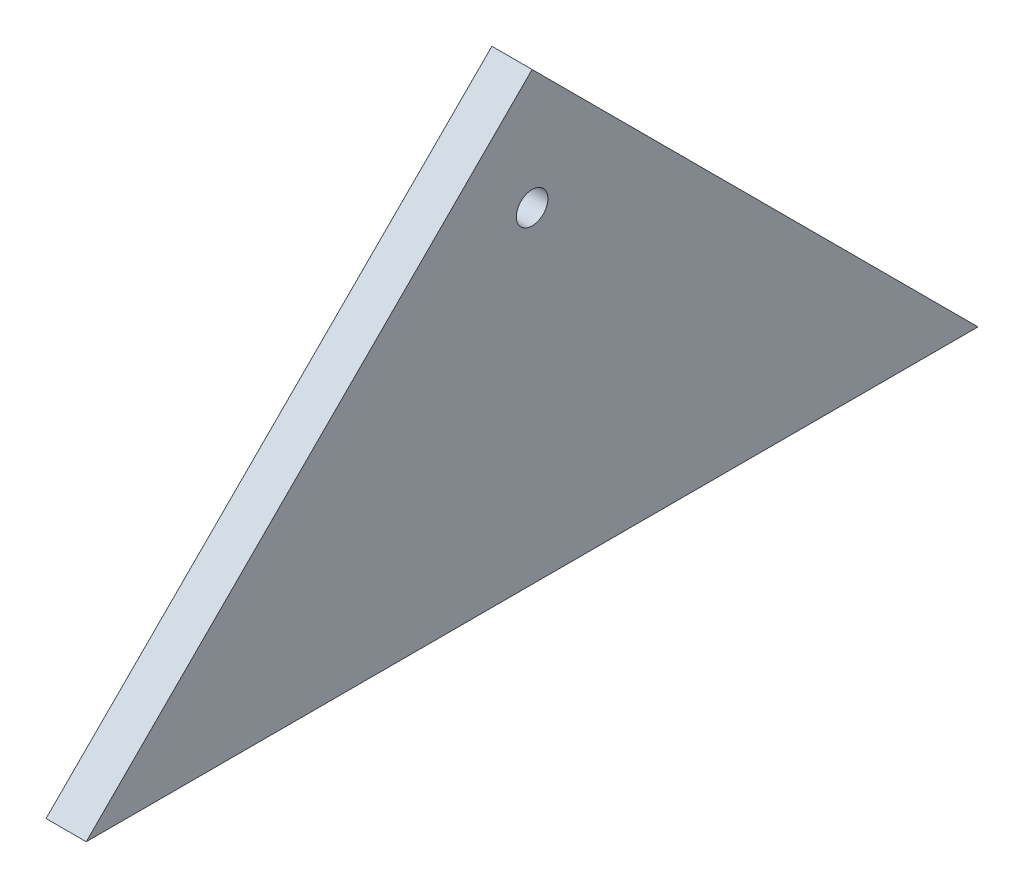
ISO-10303-21;
HEADER;
FILE_DESCRIPTION(('STEP AP214'),'2;1');
FILE_NAME('part.step','',(''),(''),'','','');
FILE_SCHEMA(('AUTOMOTIVE_DESIGN { 1 0 10303 214 1 1 1 1 }'));
ENDSEC;
DATA;
#1=APPLICATION_CONTEXT('core data for automotive mechanical design processes');
#2=APPLICATION_PROTOCOL_DEFINITION('international standard','automotive_design',2000,#1);
#3=PRODUCT_CONTEXT('',#1,'mechanical');
#4=PRODUCT('Part','Part','',(#3));
#5=PRODUCT_RELATED_PRODUCT_CATEGORY('part','',(#4));
#6=PRODUCT_DEFINITION_FORMATION('','',#4);
#7=PRODUCT_DEFINITION_CONTEXT('part definition',#1,'design');
#8=PRODUCT_DEFINITION('design','',#6,#7);
#9=PRODUCT_DEFINITION_SHAPE('','',#8);
#10=(LENGTH_UNIT() NAMED_UNIT(*) SI_UNIT(.MILLI.,.METRE.));
#11=(NAMED_UNIT(*) PLANE_ANGLE_UNIT() SI_UNIT($,.RADIAN.));
#12=(NAMED_UNIT(*) SI_UNIT($,.STERADIAN.) SOLID_ANGLE_UNIT());
#13=UNCERTAINTY_MEASURE_WITH_UNIT(LENGTH_MEASURE(1.E-05),#10,'distance_accuracy_value','');
#14=(GEOMETRIC_REPRESENTATION_CONTEXT(3) GLOBAL_UNCERTAINTY_ASSIGNED_CONTEXT((#13)) GLOBAL_UNIT_ASSIGNED_CONTEXT((#10,
#11,#12)) REPRESENTATION_CONTEXT('',''));
#15=CARTESIAN_POINT('',(0.,0.,0.));
#16=DIRECTION('',(0.,0.,1.));
#17=DIRECTION('',(1.,0.,0.));
#18=AXIS2_PLACEMENT_3D('',#15,#16,#17);
#19=CARTESIAN_POINT('',(12.1539,0.,0.));
#20=DIRECTION('',(1.,0.,0.));
#21=DIRECTION('',(0.,0.,-1.));
#22=AXIS2_PLACEMENT_3D('',#19,#20,#21);
#23=PLANE('',#22);
#24=DIRECTION('',(0.,0.707106781186548,0.707106781186548));
#25=VECTOR('',#24,1.);
#26=CARTESIAN_POINT('',(12.1539,-98.5342418160373,-134.703841816037));
#27=LINE('',#26,#25);
#28=CARTESIAN_POINT('',(12.1539,-98.5342418160373,-134.703841816037));
#29=VERTEX_POINT('',#28);
#30=CARTESIAN_POINT('',(12.1539,36.1696,0.));
#31=VERTEX_POINT('',#30);
#32=EDGE_CURVE('E73',#29,#31,#27,.T.);
#33=ORIENTED_EDGE('',*,*,#32,.T.);
#34=DIRECTION('',(0.,-0.707106781186548,0.707106781186548));
#35=VECTOR('',#34,1.);
#36=CARTESIAN_POINT('',(12.1539,36.1696,0.));
#37=LINE('',#36,#35);
#38=CARTESIAN_POINT('',(12.1539,-98.5342418160373,134.703841816037));
#39=VERTEX_POINT('',#38);
#40=EDGE_CURVE('E69',#31,#39,#37,.T.);
#41=ORIENTED_EDGE('',*,*,#40,.T.);
#42=DIRECTION('',(0.,0.,-1.));
#43=VECTOR('',#42,1.);
#44=CARTESIAN_POINT('',(12.1539,-98.5342418160373,134.703841816037));
#45=LINE('',#44,#43);
#46=EDGE_CURVE('E49',#39,#29,#45,.T.);
#47=ORIENTED_EDGE('',*,*,#46,.T.);
#48=EDGE_LOOP('',(#33,#41,#47));
#49=FACE_BOUND('',#48,.T.);
#50=CARTESIAN_POINT('',(12.1539,0.,0.));
#51=DIRECTION('',(1.,0.,0.));
#52=DIRECTION('',(0.,0.,-1.));
#53=AXIS2_PLACEMENT_3D('',#50,#51,#52);
#54=CIRCLE('',#53,4.7625);
#55=CARTESIAN_POINT('',(12.1539,0.,-4.7625));
#56=VERTEX_POINT('',#55);
#57=EDGE_CURVE('E83',#56,#56,#54,.T.);
#58=ORIENTED_EDGE('',*,*,#57,.F.);
#59=EDGE_LOOP('',(#58));
#60=FACE_BOUND('',#59,.T.);
#61=ADVANCED_FACE('F32',(#49,#60),#23,.T.);
#62=CARTESIAN_POINT('',(0.,0.,0.));
#63=DIRECTION('',(1.,0.,0.));
#64=DIRECTION('',(0.,0.,-1.));
#65=AXIS2_PLACEMENT_3D('',#62,#63,#64);
#66=PLANE('',#65);
#67=DIRECTION('',(0.,0.707106781186548,0.707106781186548));
#68=VECTOR('',#67,1.);
#69=CARTESIAN_POINT('',(0.,-98.5342418160373,-134.703841816037));
#70=LINE('',#69,#68);
#71=CARTESIAN_POINT('',(0.,-98.5342418160373,-134.703841816037));
#72=VERTEX_POINT('',#71);
#73=CARTESIAN_POINT('',(0.,36.1696,0.));
#74=VERTEX_POINT('',#73);
#75=EDGE_CURVE('E80',#72,#74,#70,.T.);
#76=ORIENTED_EDGE('',*,*,#75,.F.);
#77=DIRECTION('',(0.,0.,-1.));
#78=VECTOR('',#77,1.);
#79=CARTESIAN_POINT('',(0.,-98.5342418160373,134.703841816037));
#80=LINE('',#79,#78);
#81=CARTESIAN_POINT('',(0.,-98.5342418160373,134.703841816037));
#82=VERTEX_POINT('',#81);
#83=EDGE_CURVE('E66',#82,#72,#80,.T.);
#84=ORIENTED_EDGE('',*,*,#83,.F.);
#85=DIRECTION('',(0.,-0.707106781186548,0.707106781186548));
#86=VECTOR('',#85,1.);
#87=CARTESIAN_POINT('',(0.,36.1696,0.));
#88=LINE('',#87,#86);
#89=EDGE_CURVE('E61',#74,#82,#88,.T.);
#90=ORIENTED_EDGE('',*,*,#89,.F.);
#91=EDGE_LOOP('',(#76,#84,#90));
#92=FACE_BOUND('',#91,.T.);
#93=CARTESIAN_POINT('',(0.,0.,0.));
#94=DIRECTION('',(1.,0.,0.));
#95=DIRECTION('',(0.,0.,-1.));
#96=AXIS2_PLACEMENT_3D('',#93,#94,#95);
#97=CIRCLE('',#96,4.7625);
#98=CARTESIAN_POINT('',(0.,0.,-4.7625));
#99=VERTEX_POINT('',#98);
#100=EDGE_CURVE('E87',#99,#99,#97,.T.);
#101=ORIENTED_EDGE('',*,*,#100,.T.);
#102=EDGE_LOOP('',(#101));
#103=FACE_BOUND('',#102,.T.);
#104=ADVANCED_FACE('F93',(#92,#103),#66,.F.);
#105=CARTESIAN_POINT('',(12.1539,-98.5342418160373,-134.703841816037));
#106=DIRECTION('',(0.,-0.707106781186547,0.707106781186547));
#107=DIRECTION('',(0.,-0.707106781186548,-0.707106781186548));
#108=AXIS2_PLACEMENT_3D('',#105,#106,#107);
#109=PLANE('',#108);
#110=ORIENTED_EDGE('',*,*,#75,.T.);
#111=DIRECTION('',(-1.,0.,0.));
#112=VECTOR('',#111,1.);
#113=CARTESIAN_POINT('',(12.1539,36.1696,0.));
#114=LINE('',#113,#112);
#115=EDGE_CURVE('E11',#31,#74,#114,.T.);
#116=ORIENTED_EDGE('',*,*,#115,.F.);
#117=ORIENTED_EDGE('',*,*,#32,.F.);
#118=DIRECTION('',(-1.,0.,0.));
#119=VECTOR('',#118,1.);
#120=CARTESIAN_POINT('',(12.1539,-98.5342418160373,-134.703841816037));
#121=LINE('',#120,#119);
#122=EDGE_CURVE('E81',#29,#72,#121,.T.);
#123=ORIENTED_EDGE('',*,*,#122,.T.);
#124=EDGE_LOOP('',(#110,#116,#117,#123));
#125=FACE_BOUND('',#124,.T.);
#126=ADVANCED_FACE('F34',(#125),#109,.F.);
#127=CARTESIAN_POINT('',(12.1539,36.1696,0.));
#128=DIRECTION('',(0.,-0.707106781186547,-0.707106781186547));
#129=DIRECTION('',(0.,0.707106781186548,-0.707106781186548));
#130=AXIS2_PLACEMENT_3D('',#127,#128,#129);
#131=PLANE('',#130);
#132=ORIENTED_EDGE('',*,*,#89,.T.);
#133=DIRECTION('',(-1.,0.,0.));
#134=VECTOR('',#133,1.);
#135=CARTESIAN_POINT('',(12.1539,-98.5342418160373,134.703841816037));
#136=LINE('',#135,#134);
#137=EDGE_CURVE('E41',#39,#82,#136,.T.);
#138=ORIENTED_EDGE('',*,*,#137,.F.);
#139=ORIENTED_EDGE('',*,*,#40,.F.);
#140=ORIENTED_EDGE('',*,*,#115,.T.);
#141=EDGE_LOOP('',(#132,#138,#139,#140));
#142=FACE_BOUND('',#141,.T.);
#143=ADVANCED_FACE('F70',(#142),#131,.F.);
#144=CARTESIAN_POINT('',(12.1539,-98.5342418160373,134.703841816037));
#145=DIRECTION('',(0.,1.,0.));
#146=DIRECTION('',(0.,0.,1.));
#147=AXIS2_PLACEMENT_3D('',#144,#145,#146);
#148=PLANE('',#147);
#149=ORIENTED_EDGE('',*,*,#83,.T.);
#150=ORIENTED_EDGE('',*,*,#122,.F.);
#151=ORIENTED_EDGE('',*,*,#46,.F.);
#152=ORIENTED_EDGE('',*,*,#137,.T.);
#153=EDGE_LOOP('',(#149,#150,#151,#152));
#154=FACE_BOUND('',#153,.T.);
#155=ADVANCED_FACE('F92',(#154),#148,.F.);
#156=CARTESIAN_POINT('',(12.1539,0.,0.));
#157=DIRECTION('',(-1.,0.,0.));
#158=DIRECTION('',(0.,0.,1.));
#159=AXIS2_PLACEMENT_3D('',#156,#157,#158);
#160=CYLINDRICAL_SURFACE('',#159,4.7625);
#161=ORIENTED_EDGE('',*,*,#57,.T.);
#162=EDGE_LOOP('',(#161));
#163=FACE_BOUND('',#162,.T.);
#164=ORIENTED_EDGE('',*,*,#100,.F.);
#165=EDGE_LOOP('',(#164));
#166=FACE_BOUND('',#165,.T.);
#167=ADVANCED_FACE('F101',(#163,#166),#160,.F.);
#168=CLOSED_SHELL('',(#61,#104,#126,#143,#155,#167));
#169=MANIFOLD_SOLID_BREP('B2',#168);
#170=ADVANCED_BREP_SHAPE_REPRESENTATION('',(#18,#169),#14);
#171=SHAPE_DEFINITION_REPRESENTATION(#9,#170);
ENDSEC;
END-ISO-10303-21;
